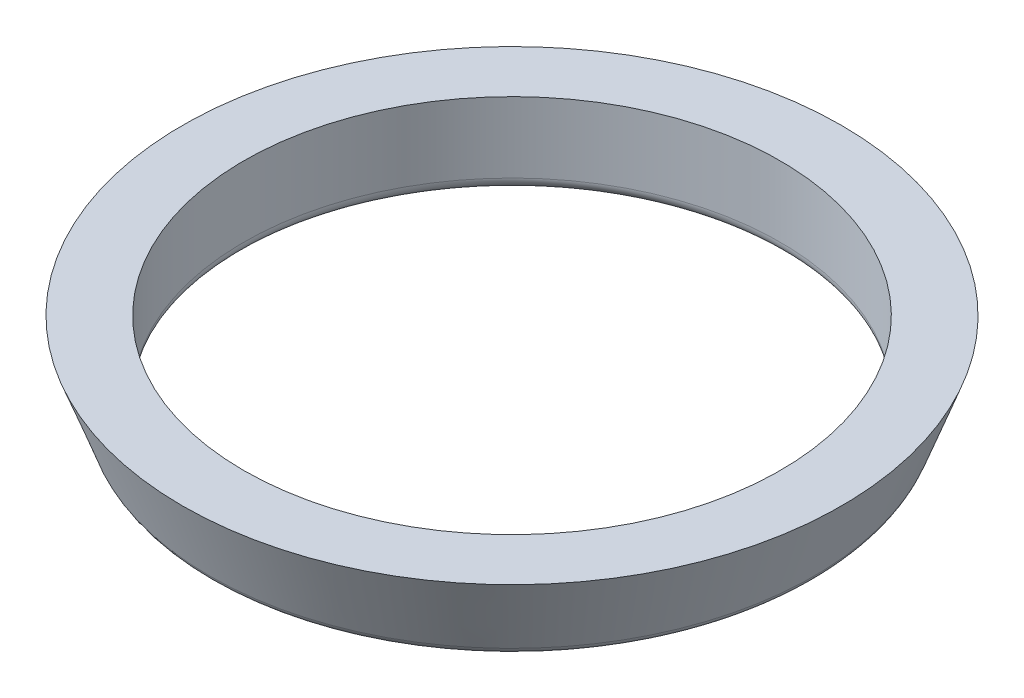
ISO-10303-21;
HEADER;
FILE_DESCRIPTION(('STEP AP214'),'2;1');
FILE_NAME('part.step','',(''),(''),'','','');
FILE_SCHEMA(('AUTOMOTIVE_DESIGN { 1 0 10303 214 1 1 1 1 }'));
ENDSEC;
DATA;
#1=APPLICATION_CONTEXT('core data for automotive mechanical design processes');
#2=APPLICATION_PROTOCOL_DEFINITION('international standard','automotive_design',2000,#1);
#3=PRODUCT_CONTEXT('',#1,'mechanical');
#4=PRODUCT('Part','Part','',(#3));
#5=PRODUCT_RELATED_PRODUCT_CATEGORY('part','',(#4));
#6=PRODUCT_DEFINITION_FORMATION('','',#4);
#7=PRODUCT_DEFINITION_CONTEXT('part definition',#1,'design');
#8=PRODUCT_DEFINITION('design','',#6,#7);
#9=PRODUCT_DEFINITION_SHAPE('','',#8);
#10=(LENGTH_UNIT() NAMED_UNIT(*) SI_UNIT(.MILLI.,.METRE.));
#11=(NAMED_UNIT(*) PLANE_ANGLE_UNIT() SI_UNIT($,.RADIAN.));
#12=(NAMED_UNIT(*) SI_UNIT($,.STERADIAN.) SOLID_ANGLE_UNIT());
#13=UNCERTAINTY_MEASURE_WITH_UNIT(LENGTH_MEASURE(1.E-05),#10,'distance_accuracy_value','');
#14=(GEOMETRIC_REPRESENTATION_CONTEXT(3) GLOBAL_UNCERTAINTY_ASSIGNED_CONTEXT((#13)) GLOBAL_UNIT_ASSIGNED_CONTEXT((#10,
#11,#12)) REPRESENTATION_CONTEXT('',''));
#15=CARTESIAN_POINT('',(0.,0.,0.));
#16=DIRECTION('',(0.,0.,1.));
#17=DIRECTION('',(1.,0.,0.));
#18=AXIS2_PLACEMENT_3D('',#15,#16,#17);
#19=CARTESIAN_POINT('',(0.,0.,87.5));
#20=DIRECTION('',(0.,1.,0.));
#21=DIRECTION('',(0.,0.,1.));
#22=AXIS2_PLACEMENT_3D('',#19,#20,#21);
#23=PLANE('',#22);
#24=CARTESIAN_POINT('',(0.,0.,0.));
#25=DIRECTION('',(0.,1.,0.));
#26=DIRECTION('',(0.,0.,1.));
#27=AXIS2_PLACEMENT_3D('',#24,#25,#26);
#28=CIRCLE('',#27,107.5);
#29=CARTESIAN_POINT('',(0.,0.,107.5));
#30=VERTEX_POINT('',#29);
#31=EDGE_CURVE('E10',#30,#30,#28,.T.);
#32=ORIENTED_EDGE('',*,*,#31,.T.);
#33=EDGE_LOOP('',(#32));
#34=FACE_BOUND('',#33,.T.);
#35=CARTESIAN_POINT('',(0.,0.,0.));
#36=DIRECTION('',(0.,1.,0.));
#37=DIRECTION('',(0.,0.,1.));
#38=AXIS2_PLACEMENT_3D('',#35,#36,#37);
#39=CIRCLE('',#38,87.5);
#40=CARTESIAN_POINT('',(0.,0.,87.5));
#41=VERTEX_POINT('',#40);
#42=EDGE_CURVE('E52',#41,#41,#39,.T.);
#43=ORIENTED_EDGE('',*,*,#42,.F.);
#44=EDGE_LOOP('',(#43));
#45=FACE_BOUND('',#44,.T.);
#46=ADVANCED_FACE('F30',(#34,#45),#23,.T.);
#47=CARTESIAN_POINT('',(0.,0.,0.));
#48=DIRECTION('',(0.,1.,0.));
#49=DIRECTION('',(0.,0.,1.));
#50=AXIS2_PLACEMENT_3D('',#47,#48,#49);
#51=CONICAL_SURFACE('',#50,107.5,0.35470565201094);
#52=CARTESIAN_POINT('',(0.,-24.3892574232944,0.));
#53=DIRECTION('',(0.,1.,0.));
#54=DIRECTION('',(0.,0.,1.));
#55=AXIS2_PLACEMENT_3D('',#52,#53,#54);
#56=CIRCLE('',#55,98.4669416950762);
#57=CARTESIAN_POINT('',(0.,-24.3892574232944,98.4669416950762));
#58=VERTEX_POINT('',#57);
#59=EDGE_CURVE('E36',#58,#58,#56,.T.);
#60=ORIENTED_EDGE('',*,*,#59,.T.);
#61=EDGE_LOOP('',(#60));
#62=FACE_BOUND('',#61,.T.);
#63=ORIENTED_EDGE('',*,*,#31,.F.);
#64=EDGE_LOOP('',(#63));
#65=FACE_BOUND('',#64,.T.);
#66=ADVANCED_FACE('F60',(#62,#65),#51,.T.);
#67=CARTESIAN_POINT('',(0.,-23.,0.));
#68=DIRECTION('',(0.,1.,0.));
#69=DIRECTION('',(0.,0.,1.));
#70=AXIS2_PLACEMENT_3D('',#67,#68,#69);
#71=TOROIDAL_SURFACE('',#70,94.7159466521813,4.);
#72=CARTESIAN_POINT('',(0.,-27.,0.));
#73=DIRECTION('',(0.,1.,0.));
#74=DIRECTION('',(0.,0.,1.));
#75=AXIS2_PLACEMENT_3D('',#72,#73,#74);
#76=CIRCLE('',#75,94.7159466521813);
#77=CARTESIAN_POINT('',(0.,-27.,94.7159466521813));
#78=VERTEX_POINT('',#77);
#79=EDGE_CURVE('E40',#78,#78,#76,.T.);
#80=ORIENTED_EDGE('',*,*,#79,.T.);
#81=EDGE_LOOP('',(#80));
#82=FACE_BOUND('',#81,.T.);
#83=ORIENTED_EDGE('',*,*,#59,.F.);
#84=EDGE_LOOP('',(#83));
#85=FACE_BOUND('',#84,.T.);
#86=ADVANCED_FACE('F64',(#82,#85),#71,.T.);
#87=CARTESIAN_POINT('',(0.,-27.,94.7159466521813));
#88=DIRECTION('',(0.,-1.,0.));
#89=DIRECTION('',(0.,0.,-1.));
#90=AXIS2_PLACEMENT_3D('',#87,#88,#89);
#91=PLANE('',#90);
#92=CARTESIAN_POINT('',(0.,-27.,0.));
#93=DIRECTION('',(0.,1.,0.));
#94=DIRECTION('',(0.,0.,1.));
#95=AXIS2_PLACEMENT_3D('',#92,#93,#94);
#96=CIRCLE('',#95,91.5);
#97=CARTESIAN_POINT('',(0.,-27.,91.5));
#98=VERTEX_POINT('',#97);
#99=EDGE_CURVE('E44',#98,#98,#96,.T.);
#100=ORIENTED_EDGE('',*,*,#99,.T.);
#101=EDGE_LOOP('',(#100));
#102=FACE_BOUND('',#101,.T.);
#103=ORIENTED_EDGE('',*,*,#79,.F.);
#104=EDGE_LOOP('',(#103));
#105=FACE_BOUND('',#104,.T.);
#106=ADVANCED_FACE('F68',(#102,#105),#91,.T.);
#107=CARTESIAN_POINT('',(0.,-23.,0.));
#108=DIRECTION('',(0.,1.,0.));
#109=DIRECTION('',(0.,0.,1.));
#110=AXIS2_PLACEMENT_3D('',#107,#108,#109);
#111=TOROIDAL_SURFACE('',#110,91.5,4.);
#112=CARTESIAN_POINT('',(0.,-23.,0.));
#113=DIRECTION('',(0.,1.,0.));
#114=DIRECTION('',(0.,0.,1.));
#115=AXIS2_PLACEMENT_3D('',#112,#113,#114);
#116=CIRCLE('',#115,87.5);
#117=CARTESIAN_POINT('',(0.,-23.,87.5));
#118=VERTEX_POINT('',#117);
#119=EDGE_CURVE('E49',#118,#118,#116,.T.);
#120=ORIENTED_EDGE('',*,*,#119,.T.);
#121=EDGE_LOOP('',(#120));
#122=FACE_BOUND('',#121,.T.);
#123=ORIENTED_EDGE('',*,*,#99,.F.);
#124=EDGE_LOOP('',(#123));
#125=FACE_BOUND('',#124,.T.);
#126=ADVANCED_FACE('F75',(#122,#125),#111,.T.);
#127=CARTESIAN_POINT('',(0.,0.,0.));
#128=DIRECTION('',(0.,1.,0.));
#129=DIRECTION('',(0.,0.,1.));
#130=AXIS2_PLACEMENT_3D('',#127,#128,#129);
#131=CYLINDRICAL_SURFACE('',#130,87.5);
#132=ORIENTED_EDGE('',*,*,#42,.T.);
#133=EDGE_LOOP('',(#132));
#134=FACE_BOUND('',#133,.T.);
#135=ORIENTED_EDGE('',*,*,#119,.F.);
#136=EDGE_LOOP('',(#135));
#137=FACE_BOUND('',#136,.T.);
#138=ADVANCED_FACE('F56',(#134,#137),#131,.F.);
#139=CLOSED_SHELL('',(#46,#66,#86,#106,#126,#138));
#140=MANIFOLD_SOLID_BREP('B2',#139);
#141=ADVANCED_BREP_SHAPE_REPRESENTATION('',(#18,#140),#14);
#142=SHAPE_DEFINITION_REPRESENTATION(#9,#141);
ENDSEC;
END-ISO-10303-21;
